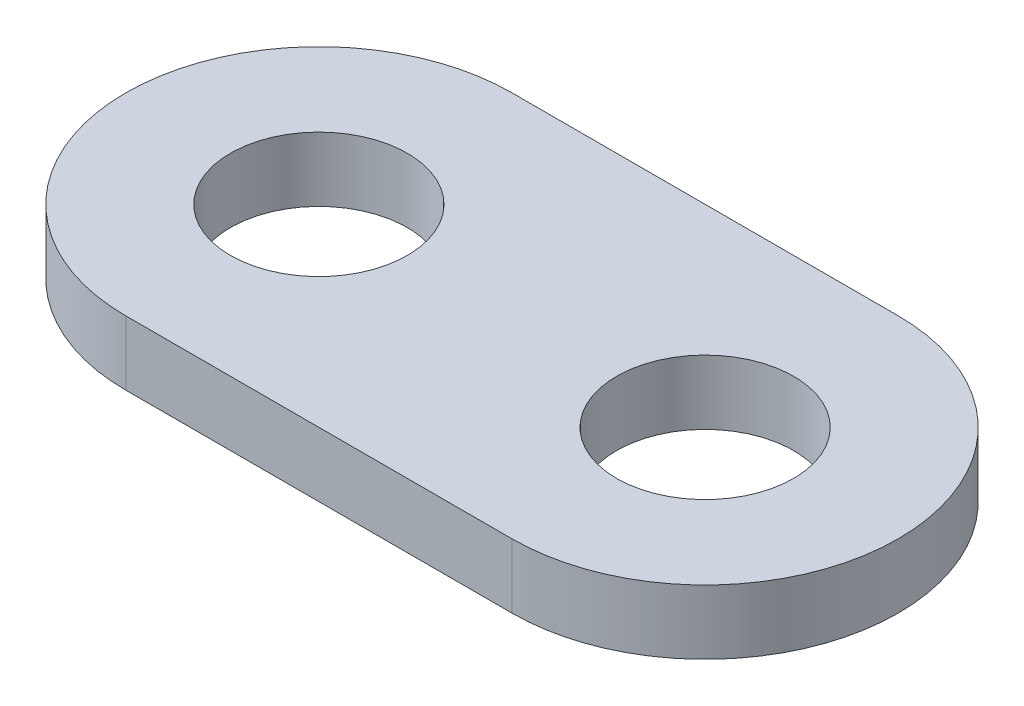
ISO-10303-21;
HEADER;
FILE_DESCRIPTION(('STEP AP214'),'2;1');
FILE_NAME('part.step','',(''),(''),'','','');
FILE_SCHEMA(('AUTOMOTIVE_DESIGN { 1 0 10303 214 1 1 1 1 }'));
ENDSEC;
DATA;
#1=APPLICATION_CONTEXT('core data for automotive mechanical design processes');
#2=APPLICATION_PROTOCOL_DEFINITION('international standard','automotive_design',2000,#1);
#3=PRODUCT_CONTEXT('',#1,'mechanical');
#4=PRODUCT('Part','Part','',(#3));
#5=PRODUCT_RELATED_PRODUCT_CATEGORY('part','',(#4));
#6=PRODUCT_DEFINITION_FORMATION('','',#4);
#7=PRODUCT_DEFINITION_CONTEXT('part definition',#1,'design');
#8=PRODUCT_DEFINITION('design','',#6,#7);
#9=PRODUCT_DEFINITION_SHAPE('','',#8);
#10=(LENGTH_UNIT() NAMED_UNIT(*) SI_UNIT(.MILLI.,.METRE.));
#11=(NAMED_UNIT(*) PLANE_ANGLE_UNIT() SI_UNIT($,.RADIAN.));
#12=(NAMED_UNIT(*) SI_UNIT($,.STERADIAN.) SOLID_ANGLE_UNIT());
#13=UNCERTAINTY_MEASURE_WITH_UNIT(LENGTH_MEASURE(1.E-05),#10,'distance_accuracy_value','');
#14=(GEOMETRIC_REPRESENTATION_CONTEXT(3) GLOBAL_UNCERTAINTY_ASSIGNED_CONTEXT((#13)) GLOBAL_UNIT_ASSIGNED_CONTEXT((#10,
#11,#12)) REPRESENTATION_CONTEXT('',''));
#15=CARTESIAN_POINT('',(0.,0.,0.));
#16=DIRECTION('',(0.,0.,1.));
#17=DIRECTION('',(1.,0.,0.));
#18=AXIS2_PLACEMENT_3D('',#15,#16,#17);
#19=CARTESIAN_POINT('',(0.,2.,6.));
#20=DIRECTION('',(0.,0.,-1.));
#21=DIRECTION('',(-1.,0.,0.));
#22=AXIS2_PLACEMENT_3D('',#19,#20,#21);
#23=PLANE('',#22);
#24=DIRECTION('',(1.,0.,0.));
#25=VECTOR('',#24,1.);
#26=CARTESIAN_POINT('',(0.,0.,6.));
#27=LINE('',#26,#25);
#28=CARTESIAN_POINT('',(-6.,0.,6.));
#29=VERTEX_POINT('',#28);
#30=CARTESIAN_POINT('',(6.,0.,6.));
#31=VERTEX_POINT('',#30);
#32=EDGE_CURVE('E102',#29,#31,#27,.T.);
#33=ORIENTED_EDGE('',*,*,#32,.T.);
#34=DIRECTION('',(0.,-1.,0.));
#35=VECTOR('',#34,1.);
#36=CARTESIAN_POINT('',(6.,2.,6.));
#37=LINE('',#36,#35);
#38=CARTESIAN_POINT('',(6.,2.,6.));
#39=VERTEX_POINT('',#38);
#40=EDGE_CURVE('E11',#39,#31,#37,.T.);
#41=ORIENTED_EDGE('',*,*,#40,.F.);
#42=DIRECTION('',(1.,0.,0.));
#43=VECTOR('',#42,1.);
#44=CARTESIAN_POINT('',(0.,2.,6.));
#45=LINE('',#44,#43);
#46=CARTESIAN_POINT('',(-6.,2.,6.));
#47=VERTEX_POINT('',#46);
#48=EDGE_CURVE('E81',#47,#39,#45,.T.);
#49=ORIENTED_EDGE('',*,*,#48,.F.);
#50=DIRECTION('',(0.,-1.,0.));
#51=VECTOR('',#50,1.);
#52=CARTESIAN_POINT('',(-6.,2.,6.));
#53=LINE('',#52,#51);
#54=EDGE_CURVE('E101',#47,#29,#53,.T.);
#55=ORIENTED_EDGE('',*,*,#54,.T.);
#56=EDGE_LOOP('',(#33,#41,#49,#55));
#57=FACE_BOUND('',#56,.T.);
#58=ADVANCED_FACE('F33',(#57),#23,.F.);
#59=CARTESIAN_POINT('',(6.,2.,0.));
#60=DIRECTION('',(0.,-1.,0.));
#61=DIRECTION('',(0.,0.,-1.));
#62=AXIS2_PLACEMENT_3D('',#59,#60,#61);
#63=CYLINDRICAL_SURFACE('',#62,6.);
#64=CARTESIAN_POINT('',(6.,0.,0.));
#65=DIRECTION('',(0.,1.,0.));
#66=DIRECTION('',(0.,0.,1.));
#67=AXIS2_PLACEMENT_3D('',#64,#65,#66);
#68=CIRCLE('',#67,6.);
#69=CARTESIAN_POINT('',(6.,0.,-6.));
#70=VERTEX_POINT('',#69);
#71=EDGE_CURVE('E86',#31,#70,#68,.T.);
#72=ORIENTED_EDGE('',*,*,#71,.T.);
#73=DIRECTION('',(0.,-1.,0.));
#74=VECTOR('',#73,1.);
#75=CARTESIAN_POINT('',(6.,2.,-6.));
#76=LINE('',#75,#74);
#77=CARTESIAN_POINT('',(6.,2.,-6.));
#78=VERTEX_POINT('',#77);
#79=EDGE_CURVE('E41',#78,#70,#76,.T.);
#80=ORIENTED_EDGE('',*,*,#79,.F.);
#81=CARTESIAN_POINT('',(6.,2.,0.));
#82=DIRECTION('',(0.,1.,0.));
#83=DIRECTION('',(0.,0.,1.));
#84=AXIS2_PLACEMENT_3D('',#81,#82,#83);
#85=CIRCLE('',#84,6.);
#86=EDGE_CURVE('E75',#39,#78,#85,.T.);
#87=ORIENTED_EDGE('',*,*,#86,.F.);
#88=ORIENTED_EDGE('',*,*,#40,.T.);
#89=EDGE_LOOP('',(#72,#80,#87,#88));
#90=FACE_BOUND('',#89,.T.);
#91=ADVANCED_FACE('F85',(#90),#63,.T.);
#92=CARTESIAN_POINT('',(0.,2.,-6.));
#93=DIRECTION('',(0.,0.,-1.));
#94=DIRECTION('',(-1.,0.,0.));
#95=AXIS2_PLACEMENT_3D('',#92,#93,#94);
#96=PLANE('',#95);
#97=DIRECTION('',(1.,0.,0.));
#98=VECTOR('',#97,1.);
#99=CARTESIAN_POINT('',(0.,0.,-6.));
#100=LINE('',#99,#98);
#101=CARTESIAN_POINT('',(-6.,0.,-6.));
#102=VERTEX_POINT('',#101);
#103=EDGE_CURVE('E106',#102,#70,#100,.T.);
#104=ORIENTED_EDGE('',*,*,#103,.F.);
#105=DIRECTION('',(0.,-1.,0.));
#106=VECTOR('',#105,1.);
#107=CARTESIAN_POINT('',(-6.,2.,-6.));
#108=LINE('',#107,#106);
#109=CARTESIAN_POINT('',(-6.,2.,-6.));
#110=VERTEX_POINT('',#109);
#111=EDGE_CURVE('E65',#110,#102,#108,.T.);
#112=ORIENTED_EDGE('',*,*,#111,.F.);
#113=DIRECTION('',(1.,0.,0.));
#114=VECTOR('',#113,1.);
#115=CARTESIAN_POINT('',(0.,2.,-6.));
#116=LINE('',#115,#114);
#117=EDGE_CURVE('E79',#110,#78,#116,.T.);
#118=ORIENTED_EDGE('',*,*,#117,.T.);
#119=ORIENTED_EDGE('',*,*,#79,.T.);
#120=EDGE_LOOP('',(#104,#112,#118,#119));
#121=FACE_BOUND('',#120,.T.);
#122=ADVANCED_FACE('F90',(#121),#96,.T.);
#123=CARTESIAN_POINT('',(-6.,2.,0.));
#124=DIRECTION('',(0.,-1.,0.));
#125=DIRECTION('',(0.,0.,-1.));
#126=AXIS2_PLACEMENT_3D('',#123,#124,#125);
#127=CYLINDRICAL_SURFACE('',#126,2.75);
#128=CARTESIAN_POINT('',(-6.,2.,0.));
#129=DIRECTION('',(0.,1.,0.));
#130=DIRECTION('',(0.,0.,1.));
#131=AXIS2_PLACEMENT_3D('',#128,#129,#130);
#132=CIRCLE('',#131,2.75);
#133=CARTESIAN_POINT('',(-6.,2.,2.75));
#134=VERTEX_POINT('',#133);
#135=EDGE_CURVE('E92',#134,#134,#132,.T.);
#136=ORIENTED_EDGE('',*,*,#135,.T.);
#137=EDGE_LOOP('',(#136));
#138=FACE_BOUND('',#137,.T.);
#139=CARTESIAN_POINT('',(-6.,0.,0.));
#140=DIRECTION('',(0.,1.,0.));
#141=DIRECTION('',(0.,0.,1.));
#142=AXIS2_PLACEMENT_3D('',#139,#140,#141);
#143=CIRCLE('',#142,2.75);
#144=CARTESIAN_POINT('',(-6.,0.,2.75));
#145=VERTEX_POINT('',#144);
#146=EDGE_CURVE('E109',#145,#145,#143,.T.);
#147=ORIENTED_EDGE('',*,*,#146,.F.);
#148=EDGE_LOOP('',(#147));
#149=FACE_BOUND('',#148,.T.);
#150=ADVANCED_FACE('F137',(#138,#149),#127,.F.);
#151=CARTESIAN_POINT('',(-6.,2.,0.));
#152=DIRECTION('',(0.,-1.,0.));
#153=DIRECTION('',(0.,0.,-1.));
#154=AXIS2_PLACEMENT_3D('',#151,#152,#153);
#155=CYLINDRICAL_SURFACE('',#154,6.);
#156=CARTESIAN_POINT('',(-6.,0.,0.));
#157=DIRECTION('',(0.,1.,0.));
#158=DIRECTION('',(0.,0.,1.));
#159=AXIS2_PLACEMENT_3D('',#156,#157,#158);
#160=CIRCLE('',#159,6.);
#161=EDGE_CURVE('E68',#102,#29,#160,.T.);
#162=ORIENTED_EDGE('',*,*,#161,.T.);
#163=ORIENTED_EDGE('',*,*,#54,.F.);
#164=CARTESIAN_POINT('',(-6.,2.,0.));
#165=DIRECTION('',(0.,1.,0.));
#166=DIRECTION('',(0.,0.,1.));
#167=AXIS2_PLACEMENT_3D('',#164,#165,#166);
#168=CIRCLE('',#167,6.);
#169=EDGE_CURVE('E49',#110,#47,#168,.T.);
#170=ORIENTED_EDGE('',*,*,#169,.F.);
#171=ORIENTED_EDGE('',*,*,#111,.T.);
#172=EDGE_LOOP('',(#162,#163,#170,#171));
#173=FACE_BOUND('',#172,.T.);
#174=ADVANCED_FACE('F129',(#173),#155,.T.);
#175=CARTESIAN_POINT('',(6.,2.,0.));
#176=DIRECTION('',(0.,-1.,0.));
#177=DIRECTION('',(0.,0.,-1.));
#178=AXIS2_PLACEMENT_3D('',#175,#176,#177);
#179=CYLINDRICAL_SURFACE('',#178,2.75);
#180=CARTESIAN_POINT('',(6.,2.,0.));
#181=DIRECTION('',(0.,1.,0.));
#182=DIRECTION('',(0.,0.,1.));
#183=AXIS2_PLACEMENT_3D('',#180,#181,#182);
#184=CIRCLE('',#183,2.75);
#185=CARTESIAN_POINT('',(6.,2.,2.75));
#186=VERTEX_POINT('',#185);
#187=EDGE_CURVE('E98',#186,#186,#184,.T.);
#188=ORIENTED_EDGE('',*,*,#187,.T.);
#189=EDGE_LOOP('',(#188));
#190=FACE_BOUND('',#189,.T.);
#191=CARTESIAN_POINT('',(6.,0.,0.));
#192=DIRECTION('',(0.,1.,0.));
#193=DIRECTION('',(0.,0.,1.));
#194=AXIS2_PLACEMENT_3D('',#191,#192,#193);
#195=CIRCLE('',#194,2.75);
#196=CARTESIAN_POINT('',(6.,0.,2.75));
#197=VERTEX_POINT('',#196);
#198=EDGE_CURVE('E112',#197,#197,#195,.T.);
#199=ORIENTED_EDGE('',*,*,#198,.F.);
#200=EDGE_LOOP('',(#199));
#201=FACE_BOUND('',#200,.T.);
#202=ADVANCED_FACE('F127',(#190,#201),#179,.F.);
#203=CARTESIAN_POINT('',(0.,2.,0.));
#204=DIRECTION('',(0.,1.,0.));
#205=DIRECTION('',(0.,0.,1.));
#206=AXIS2_PLACEMENT_3D('',#203,#204,#205);
#207=PLANE('',#206);
#208=ORIENTED_EDGE('',*,*,#48,.T.);
#209=ORIENTED_EDGE('',*,*,#86,.T.);
#210=ORIENTED_EDGE('',*,*,#117,.F.);
#211=ORIENTED_EDGE('',*,*,#169,.T.);
#212=EDGE_LOOP('',(#208,#209,#210,#211));
#213=FACE_BOUND('',#212,.T.);
#214=ORIENTED_EDGE('',*,*,#135,.F.);
#215=EDGE_LOOP('',(#214));
#216=FACE_BOUND('',#215,.T.);
#217=ORIENTED_EDGE('',*,*,#187,.F.);
#218=EDGE_LOOP('',(#217));
#219=FACE_BOUND('',#218,.T.);
#220=ADVANCED_FACE('F76',(#213,#216,#219),#207,.T.);
#221=CARTESIAN_POINT('',(0.,0.,0.));
#222=DIRECTION('',(0.,1.,0.));
#223=DIRECTION('',(0.,0.,1.));
#224=AXIS2_PLACEMENT_3D('',#221,#222,#223);
#225=PLANE('',#224);
#226=ORIENTED_EDGE('',*,*,#32,.F.);
#227=ORIENTED_EDGE('',*,*,#161,.F.);
#228=ORIENTED_EDGE('',*,*,#103,.T.);
#229=ORIENTED_EDGE('',*,*,#71,.F.);
#230=EDGE_LOOP('',(#226,#227,#228,#229));
#231=FACE_BOUND('',#230,.T.);
#232=ORIENTED_EDGE('',*,*,#146,.T.);
#233=EDGE_LOOP('',(#232));
#234=FACE_BOUND('',#233,.T.);
#235=ORIENTED_EDGE('',*,*,#198,.T.);
#236=EDGE_LOOP('',(#235));
#237=FACE_BOUND('',#236,.T.);
#238=ADVANCED_FACE('F119',(#231,#234,#237),#225,.F.);
#239=CLOSED_SHELL('',(#58,#91,#122,#150,#174,#202,#220,#238));
#240=MANIFOLD_SOLID_BREP('B2',#239);
#241=ADVANCED_BREP_SHAPE_REPRESENTATION('',(#18,#240),#14);
#242=SHAPE_DEFINITION_REPRESENTATION(#9,#241);
ENDSEC;
END-ISO-10303-21;
